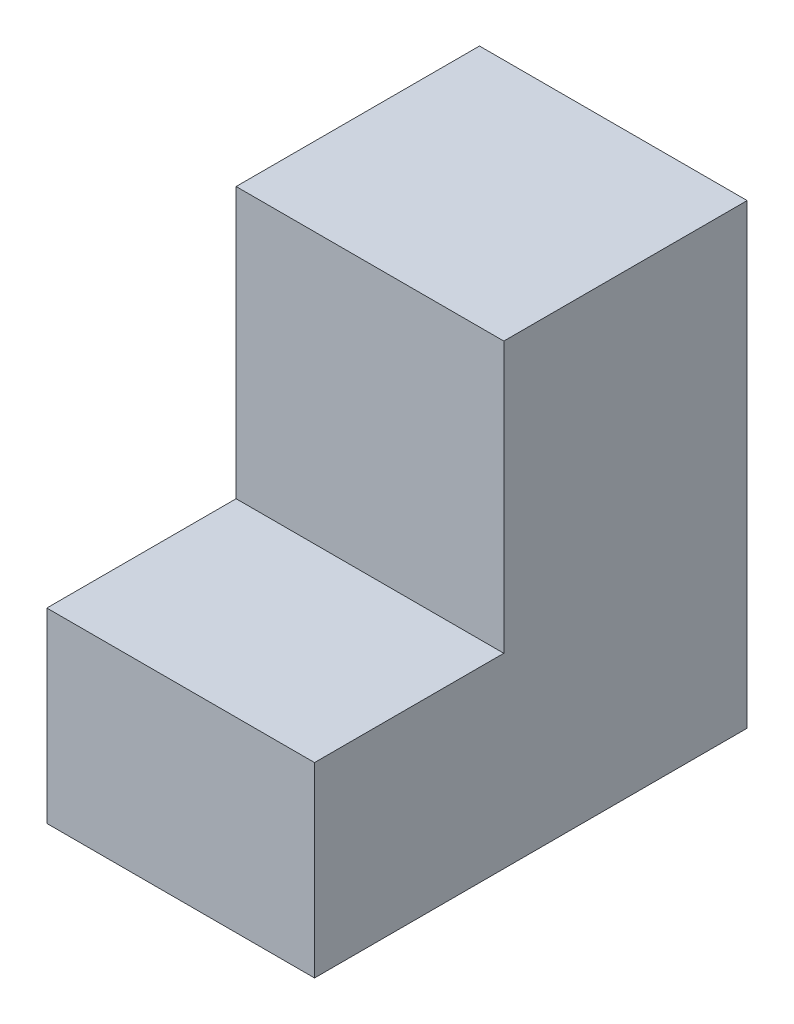
ISO-10303-21;
HEADER;
FILE_DESCRIPTION(('STEP AP214'),'2;1');
FILE_NAME('part.step','',(''),(''),'','','');
FILE_SCHEMA(('AUTOMOTIVE_DESIGN { 1 0 10303 214 1 1 1 1 }'));
ENDSEC;
DATA;
#1=APPLICATION_CONTEXT('core data for automotive mechanical design processes');
#2=APPLICATION_PROTOCOL_DEFINITION('international standard','automotive_design',2000,#1);
#3=PRODUCT_CONTEXT('',#1,'mechanical');
#4=PRODUCT('Part','Part','',(#3));
#5=PRODUCT_RELATED_PRODUCT_CATEGORY('part','',(#4));
#6=PRODUCT_DEFINITION_FORMATION('','',#4);
#7=PRODUCT_DEFINITION_CONTEXT('part definition',#1,'design');
#8=PRODUCT_DEFINITION('design','',#6,#7);
#9=PRODUCT_DEFINITION_SHAPE('','',#8);
#10=(LENGTH_UNIT() NAMED_UNIT(*) SI_UNIT(.MILLI.,.METRE.));
#11=(NAMED_UNIT(*) PLANE_ANGLE_UNIT() SI_UNIT($,.RADIAN.));
#12=(NAMED_UNIT(*) SI_UNIT($,.STERADIAN.) SOLID_ANGLE_UNIT());
#13=UNCERTAINTY_MEASURE_WITH_UNIT(LENGTH_MEASURE(1.E-05),#10,'distance_accuracy_value','');
#14=(GEOMETRIC_REPRESENTATION_CONTEXT(3) GLOBAL_UNCERTAINTY_ASSIGNED_CONTEXT((#13)) GLOBAL_UNIT_ASSIGNED_CONTEXT((#10,
#11,#12)) REPRESENTATION_CONTEXT('',''));
#15=CARTESIAN_POINT('',(0.,0.,0.));
#16=DIRECTION('',(0.,0.,1.));
#17=DIRECTION('',(1.,0.,0.));
#18=AXIS2_PLACEMENT_3D('',#15,#16,#17);
#19=CARTESIAN_POINT('',(-4.95,3.45,16.));
#20=DIRECTION('',(0.,-1.,0.));
#21=DIRECTION('',(0.,0.,-1.));
#22=AXIS2_PLACEMENT_3D('',#19,#20,#21);
#23=PLANE('',#22);
#24=DIRECTION('',(1.,0.,0.));
#25=VECTOR('',#24,1.);
#26=CARTESIAN_POINT('',(-4.95,3.45,9.));
#27=LINE('',#26,#25);
#28=CARTESIAN_POINT('',(-4.95,3.45,9.));
#29=VERTEX_POINT('',#28);
#30=CARTESIAN_POINT('',(4.95,3.45,9.));
#31=VERTEX_POINT('',#30);
#32=EDGE_CURVE('E57',#29,#31,#27,.T.);
#33=ORIENTED_EDGE('',*,*,#32,.F.);
#34=DIRECTION('',(0.,0.,-1.));
#35=VECTOR('',#34,1.);
#36=CARTESIAN_POINT('',(-4.95,3.45,16.));
#37=LINE('',#36,#35);
#38=CARTESIAN_POINT('',(-4.95,3.45,16.));
#39=VERTEX_POINT('',#38);
#40=EDGE_CURVE('E51',#39,#29,#37,.T.);
#41=ORIENTED_EDGE('',*,*,#40,.F.);
#42=DIRECTION('',(-1.,0.,0.));
#43=VECTOR('',#42,1.);
#44=CARTESIAN_POINT('',(-4.95,3.45,16.));
#45=LINE('',#44,#43);
#46=CARTESIAN_POINT('',(4.95,3.45,16.));
#47=VERTEX_POINT('',#46);
#48=EDGE_CURVE('E86',#47,#39,#45,.T.);
#49=ORIENTED_EDGE('',*,*,#48,.F.);
#50=DIRECTION('',(0.,0.,-1.));
#51=VECTOR('',#50,1.);
#52=CARTESIAN_POINT('',(4.95,3.45,16.));
#53=LINE('',#52,#51);
#54=EDGE_CURVE('E12',#47,#31,#53,.T.);
#55=ORIENTED_EDGE('',*,*,#54,.T.);
#56=EDGE_LOOP('',(#33,#41,#49,#55));
#57=FACE_BOUND('',#56,.T.);
#58=ADVANCED_FACE('F43',(#57),#23,.F.);
#59=CARTESIAN_POINT('',(4.95,-3.45,16.));
#60=DIRECTION('',(-1.,0.,0.));
#61=DIRECTION('',(0.,0.,1.));
#62=AXIS2_PLACEMENT_3D('',#59,#60,#61);
#63=PLANE('',#62);
#64=DIRECTION('',(0.,1.,0.));
#65=VECTOR('',#64,1.);
#66=CARTESIAN_POINT('',(4.95,-3.45,0.));
#67=LINE('',#66,#65);
#68=CARTESIAN_POINT('',(4.95,-3.45,0.));
#69=VERTEX_POINT('',#68);
#70=CARTESIAN_POINT('',(4.95,13.45,0.));
#71=VERTEX_POINT('',#70);
#72=EDGE_CURVE('E125',#69,#71,#67,.T.);
#73=ORIENTED_EDGE('',*,*,#72,.T.);
#74=DIRECTION('',(0.,0.,-1.));
#75=VECTOR('',#74,1.);
#76=CARTESIAN_POINT('',(4.95,13.45,9.));
#77=LINE('',#76,#75);
#78=CARTESIAN_POINT('',(4.95,13.45,9.));
#79=VERTEX_POINT('',#78);
#80=EDGE_CURVE('E113',#79,#71,#77,.T.);
#81=ORIENTED_EDGE('',*,*,#80,.F.);
#82=DIRECTION('',(0.,-1.,0.));
#83=VECTOR('',#82,1.);
#84=CARTESIAN_POINT('',(4.95,13.45,9.));
#85=LINE('',#84,#83);
#86=EDGE_CURVE('E109',#79,#31,#85,.T.);
#87=ORIENTED_EDGE('',*,*,#86,.T.);
#88=ORIENTED_EDGE('',*,*,#54,.F.);
#89=DIRECTION('',(0.,1.,0.));
#90=VECTOR('',#89,1.);
#91=CARTESIAN_POINT('',(4.95,-3.45,16.));
#92=LINE('',#91,#90);
#93=CARTESIAN_POINT('',(4.95,-3.45,16.));
#94=VERTEX_POINT('',#93);
#95=EDGE_CURVE('E132',#94,#47,#92,.T.);
#96=ORIENTED_EDGE('',*,*,#95,.F.);
#97=DIRECTION('',(0.,0.,-1.));
#98=VECTOR('',#97,1.);
#99=CARTESIAN_POINT('',(4.95,-3.45,16.));
#100=LINE('',#99,#98);
#101=EDGE_CURVE('E137',#94,#69,#100,.T.);
#102=ORIENTED_EDGE('',*,*,#101,.T.);
#103=EDGE_LOOP('',(#73,#81,#87,#88,#96,#102));
#104=FACE_BOUND('',#103,.T.);
#105=ADVANCED_FACE('F45',(#104),#63,.F.);
#106=CARTESIAN_POINT('',(-4.95,-3.45,16.));
#107=DIRECTION('',(1.,0.,0.));
#108=DIRECTION('',(0.,0.,-1.));
#109=AXIS2_PLACEMENT_3D('',#106,#107,#108);
#110=PLANE('',#109);
#111=DIRECTION('',(0.,-1.,0.));
#112=VECTOR('',#111,1.);
#113=CARTESIAN_POINT('',(-4.95,-3.45,0.));
#114=LINE('',#113,#112);
#115=CARTESIAN_POINT('',(-4.95,13.45,0.));
#116=VERTEX_POINT('',#115);
#117=CARTESIAN_POINT('',(-4.95,-3.45,0.));
#118=VERTEX_POINT('',#117);
#119=EDGE_CURVE('E127',#116,#118,#114,.T.);
#120=ORIENTED_EDGE('',*,*,#119,.T.);
#121=DIRECTION('',(0.,0.,-1.));
#122=VECTOR('',#121,1.);
#123=CARTESIAN_POINT('',(-4.95,-3.45,16.));
#124=LINE('',#123,#122);
#125=CARTESIAN_POINT('',(-4.95,-3.45,16.));
#126=VERTEX_POINT('',#125);
#127=EDGE_CURVE('E142',#126,#118,#124,.T.);
#128=ORIENTED_EDGE('',*,*,#127,.F.);
#129=DIRECTION('',(0.,-1.,0.));
#130=VECTOR('',#129,1.);
#131=CARTESIAN_POINT('',(-4.95,-3.45,16.));
#132=LINE('',#131,#130);
#133=EDGE_CURVE('E135',#39,#126,#132,.T.);
#134=ORIENTED_EDGE('',*,*,#133,.F.);
#135=ORIENTED_EDGE('',*,*,#40,.T.);
#136=DIRECTION('',(0.,-1.,0.));
#137=VECTOR('',#136,1.);
#138=CARTESIAN_POINT('',(-4.95,13.45,9.));
#139=LINE('',#138,#137);
#140=CARTESIAN_POINT('',(-4.95,13.45,9.));
#141=VERTEX_POINT('',#140);
#142=EDGE_CURVE('E107',#141,#29,#139,.T.);
#143=ORIENTED_EDGE('',*,*,#142,.F.);
#144=DIRECTION('',(0.,0.,1.));
#145=VECTOR('',#144,1.);
#146=CARTESIAN_POINT('',(-4.95,13.45,0.));
#147=LINE('',#146,#145);
#148=EDGE_CURVE('E114',#116,#141,#147,.T.);
#149=ORIENTED_EDGE('',*,*,#148,.F.);
#150=EDGE_LOOP('',(#120,#128,#134,#135,#143,#149));
#151=FACE_BOUND('',#150,.T.);
#152=ADVANCED_FACE('F123',(#151),#110,.F.);
#153=CARTESIAN_POINT('',(-4.95,-3.45,16.));
#154=DIRECTION('',(0.,1.,0.));
#155=DIRECTION('',(0.,0.,1.));
#156=AXIS2_PLACEMENT_3D('',#153,#154,#155);
#157=PLANE('',#156);
#158=DIRECTION('',(1.,0.,0.));
#159=VECTOR('',#158,1.);
#160=CARTESIAN_POINT('',(-4.95,-3.45,0.));
#161=LINE('',#160,#159);
#162=EDGE_CURVE('E81',#118,#69,#161,.T.);
#163=ORIENTED_EDGE('',*,*,#162,.T.);
#164=ORIENTED_EDGE('',*,*,#101,.F.);
#165=DIRECTION('',(1.,0.,0.));
#166=VECTOR('',#165,1.);
#167=CARTESIAN_POINT('',(-4.95,-3.45,16.));
#168=LINE('',#167,#166);
#169=EDGE_CURVE('E66',#126,#94,#168,.T.);
#170=ORIENTED_EDGE('',*,*,#169,.F.);
#171=ORIENTED_EDGE('',*,*,#127,.T.);
#172=EDGE_LOOP('',(#163,#164,#170,#171));
#173=FACE_BOUND('',#172,.T.);
#174=ADVANCED_FACE('F144',(#173),#157,.F.);
#175=CARTESIAN_POINT('',(0.,0.,16.));
#176=DIRECTION('',(0.,0.,-1.));
#177=DIRECTION('',(-1.,0.,0.));
#178=AXIS2_PLACEMENT_3D('',#175,#176,#177);
#179=PLANE('',#178);
#180=ORIENTED_EDGE('',*,*,#95,.T.);
#181=ORIENTED_EDGE('',*,*,#48,.T.);
#182=ORIENTED_EDGE('',*,*,#133,.T.);
#183=ORIENTED_EDGE('',*,*,#169,.T.);
#184=EDGE_LOOP('',(#180,#181,#182,#183));
#185=FACE_BOUND('',#184,.T.);
#186=ADVANCED_FACE('F165',(#185),#179,.F.);
#187=CARTESIAN_POINT('',(0.,0.,0.));
#188=DIRECTION('',(0.,0.,-1.));
#189=DIRECTION('',(-1.,0.,0.));
#190=AXIS2_PLACEMENT_3D('',#187,#188,#189);
#191=PLANE('',#190);
#192=CARTESIAN_POINT('',(0.,0.,0.));
#193=DIRECTION('',(0.,0.,-1.));
#194=DIRECTION('',(-1.,0.,0.));
#195=AXIS2_PLACEMENT_3D('',#192,#193,#194);
#196=CIRCLE('',#195,1.5);
#197=CARTESIAN_POINT('',(-1.5,0.,0.));
#198=VERTEX_POINT('',#197);
#199=EDGE_CURVE('E154',#198,#198,#196,.T.);
#200=ORIENTED_EDGE('',*,*,#199,.F.);
#201=EDGE_LOOP('',(#200));
#202=FACE_BOUND('',#201,.T.);
#203=ORIENTED_EDGE('',*,*,#72,.F.);
#204=ORIENTED_EDGE('',*,*,#162,.F.);
#205=ORIENTED_EDGE('',*,*,#119,.F.);
#206=DIRECTION('',(-1.,0.,0.));
#207=VECTOR('',#206,1.);
#208=CARTESIAN_POINT('',(4.95,13.45,0.));
#209=LINE('',#208,#207);
#210=EDGE_CURVE('E120',#71,#116,#209,.T.);
#211=ORIENTED_EDGE('',*,*,#210,.F.);
#212=EDGE_LOOP('',(#203,#204,#205,#211));
#213=FACE_BOUND('',#212,.T.);
#214=ADVANCED_FACE('F147',(#202,#213),#191,.T.);
#215=CARTESIAN_POINT('',(-4.95,13.45,9.));
#216=DIRECTION('',(0.,0.,-1.));
#217=DIRECTION('',(-1.,0.,0.));
#218=AXIS2_PLACEMENT_3D('',#215,#216,#217);
#219=PLANE('',#218);
#220=ORIENTED_EDGE('',*,*,#32,.T.);
#221=ORIENTED_EDGE('',*,*,#86,.F.);
#222=DIRECTION('',(1.,0.,0.));
#223=VECTOR('',#222,1.);
#224=CARTESIAN_POINT('',(-4.95,13.45,9.));
#225=LINE('',#224,#223);
#226=EDGE_CURVE('E103',#141,#79,#225,.T.);
#227=ORIENTED_EDGE('',*,*,#226,.F.);
#228=ORIENTED_EDGE('',*,*,#142,.T.);
#229=EDGE_LOOP('',(#220,#221,#227,#228));
#230=FACE_BOUND('',#229,.T.);
#231=ADVANCED_FACE('F105',(#230),#219,.F.);
#232=CARTESIAN_POINT('',(0.,13.45,0.));
#233=DIRECTION('',(0.,1.,0.));
#234=DIRECTION('',(0.,0.,1.));
#235=AXIS2_PLACEMENT_3D('',#232,#233,#234);
#236=PLANE('',#235);
#237=ORIENTED_EDGE('',*,*,#148,.T.);
#238=ORIENTED_EDGE('',*,*,#226,.T.);
#239=ORIENTED_EDGE('',*,*,#80,.T.);
#240=ORIENTED_EDGE('',*,*,#210,.T.);
#241=EDGE_LOOP('',(#237,#238,#239,#240));
#242=FACE_BOUND('',#241,.T.);
#243=ADVANCED_FACE('F118',(#242),#236,.T.);
#244=CARTESIAN_POINT('',(0.,0.,-3.));
#245=DIRECTION('',(0.,0.,1.));
#246=DIRECTION('',(1.,0.,0.));
#247=AXIS2_PLACEMENT_3D('',#244,#245,#246);
#248=CYLINDRICAL_SURFACE('',#247,1.5);
#249=CARTESIAN_POINT('',(0.,0.,-3.));
#250=DIRECTION('',(0.,0.,-1.));
#251=DIRECTION('',(-1.,0.,0.));
#252=AXIS2_PLACEMENT_3D('',#249,#250,#251);
#253=CIRCLE('',#252,1.5);
#254=CARTESIAN_POINT('',(-1.5,0.,-3.));
#255=VERTEX_POINT('',#254);
#256=EDGE_CURVE('E152',#255,#255,#253,.T.);
#257=ORIENTED_EDGE('',*,*,#256,.F.);
#258=EDGE_LOOP('',(#257));
#259=FACE_BOUND('',#258,.T.);
#260=ORIENTED_EDGE('',*,*,#199,.T.);
#261=EDGE_LOOP('',(#260));
#262=FACE_BOUND('',#261,.T.);
#263=ADVANCED_FACE('F162',(#259,#262),#248,.T.);
#264=CARTESIAN_POINT('',(0.,0.,-3.));
#265=DIRECTION('',(0.,0.,-1.));
#266=DIRECTION('',(-1.,0.,0.));
#267=AXIS2_PLACEMENT_3D('',#264,#265,#266);
#268=PLANE('',#267);
#269=ORIENTED_EDGE('',*,*,#256,.T.);
#270=EDGE_LOOP('',(#269));
#271=FACE_BOUND('',#270,.T.);
#272=ADVANCED_FACE('F238',(#271),#268,.T.);
#273=CLOSED_SHELL('',(#58,#105,#152,#174,#186,#214,#231,#243,#263,#272));
#274=MANIFOLD_SOLID_BREP('B2',#273);
#275=ADVANCED_BREP_SHAPE_REPRESENTATION('',(#18,#274),#14);
#276=SHAPE_DEFINITION_REPRESENTATION(#9,#275);
ENDSEC;
END-ISO-10303-21;
